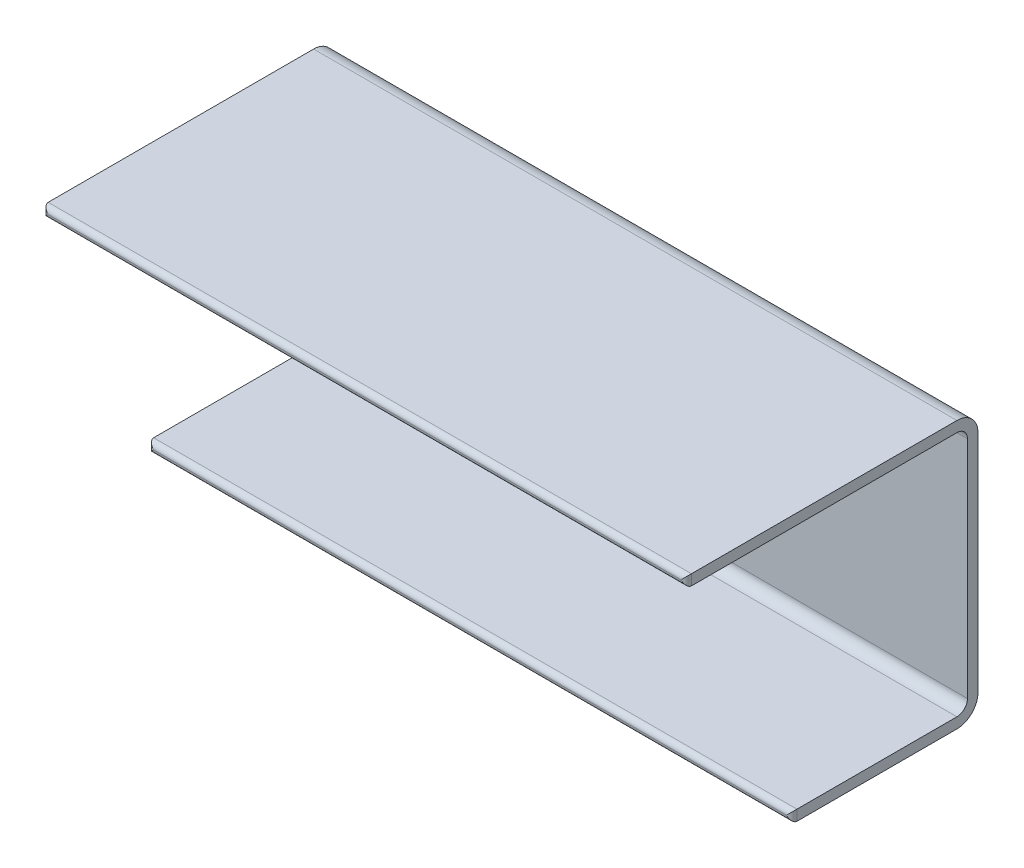
ISO-10303-21;
HEADER;
FILE_DESCRIPTION(('STEP AP214'),'2;1');
FILE_NAME('part.step','',(''),(''),'','','');
FILE_SCHEMA(('AUTOMOTIVE_DESIGN { 1 0 10303 214 1 1 1 1 }'));
ENDSEC;
DATA;
#1=APPLICATION_CONTEXT('core data for automotive mechanical design processes');
#2=APPLICATION_PROTOCOL_DEFINITION('international standard','automotive_design',2000,#1);
#3=PRODUCT_CONTEXT('',#1,'mechanical');
#4=PRODUCT('Part','Part','',(#3));
#5=PRODUCT_RELATED_PRODUCT_CATEGORY('part','',(#4));
#6=PRODUCT_DEFINITION_FORMATION('','',#4);
#7=PRODUCT_DEFINITION_CONTEXT('part definition',#1,'design');
#8=PRODUCT_DEFINITION('design','',#6,#7);
#9=PRODUCT_DEFINITION_SHAPE('','',#8);
#10=(LENGTH_UNIT() NAMED_UNIT(*) SI_UNIT(.MILLI.,.METRE.));
#11=(NAMED_UNIT(*) PLANE_ANGLE_UNIT() SI_UNIT($,.RADIAN.));
#12=(NAMED_UNIT(*) SI_UNIT($,.STERADIAN.) SOLID_ANGLE_UNIT());
#13=UNCERTAINTY_MEASURE_WITH_UNIT(LENGTH_MEASURE(1.E-05),#10,'distance_accuracy_value','');
#14=(GEOMETRIC_REPRESENTATION_CONTEXT(3) GLOBAL_UNCERTAINTY_ASSIGNED_CONTEXT((#13)) GLOBAL_UNIT_ASSIGNED_CONTEXT((#10,
#11,#12)) REPRESENTATION_CONTEXT('',''));
#15=CARTESIAN_POINT('',(0.,0.,0.));
#16=DIRECTION('',(0.,0.,1.));
#17=DIRECTION('',(1.,0.,0.));
#18=AXIS2_PLACEMENT_3D('',#15,#16,#17);
#19=CARTESIAN_POINT('',(0.,0.,-25.));
#20=DIRECTION('',(0.,0.,1.));
#21=DIRECTION('',(1.,0.,0.));
#22=AXIS2_PLACEMENT_3D('',#19,#20,#21);
#23=PLANE('',#22);
#24=CARTESIAN_POINT('',(-14.,45.5,-25.));
#25=DIRECTION('',(0.,0.,1.));
#26=DIRECTION('',(1.,0.,0.));
#27=AXIS2_PLACEMENT_3D('',#24,#25,#26);
#28=CIRCLE('',#27,11.);
#29=CARTESIAN_POINT('',(-14.,56.5,-25.));
#30=VERTEX_POINT('',#29);
#31=CARTESIAN_POINT('',(-14.,34.5,-25.));
#32=VERTEX_POINT('',#31);
#33=EDGE_CURVE('E178',#30,#32,#28,.T.);
#34=ORIENTED_EDGE('',*,*,#33,.F.);
#35=DIRECTION('',(-1.,0.,0.));
#36=VECTOR('',#35,1.);
#37=CARTESIAN_POINT('',(-14.,56.5,-25.));
#38=LINE('',#37,#36);
#39=CARTESIAN_POINT('',(14.,56.5,-25.));
#40=VERTEX_POINT('',#39);
#41=EDGE_CURVE('E184',#40,#30,#38,.T.);
#42=ORIENTED_EDGE('',*,*,#41,.F.);
#43=CARTESIAN_POINT('',(14.,45.5,-25.));
#44=DIRECTION('',(0.,0.,1.));
#45=DIRECTION('',(1.,0.,0.));
#46=AXIS2_PLACEMENT_3D('',#43,#44,#45);
#47=CIRCLE('',#46,11.);
#48=CARTESIAN_POINT('',(14.,34.5,-25.));
#49=VERTEX_POINT('',#48);
#50=EDGE_CURVE('E212',#49,#40,#47,.T.);
#51=ORIENTED_EDGE('',*,*,#50,.F.);
#52=DIRECTION('',(1.,0.,0.));
#53=VECTOR('',#52,1.);
#54=CARTESIAN_POINT('',(-14.,34.5,-25.));
#55=LINE('',#54,#53);
#56=EDGE_CURVE('E204',#32,#49,#55,.T.);
#57=ORIENTED_EDGE('',*,*,#56,.F.);
#58=EDGE_LOOP('',(#34,#42,#51,#57));
#59=FACE_BOUND('',#58,.T.);
#60=DIRECTION('',(0.,-1.,0.));
#61=VECTOR('',#60,1.);
#62=CARTESIAN_POINT('',(91.5,0.,-25.));
#63=LINE('',#62,#61);
#64=CARTESIAN_POINT('',(91.5,70.,-25.));
#65=VERTEX_POINT('',#64);
#66=CARTESIAN_POINT('',(91.5,6.,-25.));
#67=VERTEX_POINT('',#66);
#68=EDGE_CURVE('E235',#65,#67,#63,.T.);
#69=ORIENTED_EDGE('',*,*,#68,.F.);
#70=DIRECTION('',(1.,0.,0.));
#71=VECTOR('',#70,1.);
#72=CARTESIAN_POINT('',(0.,70.,-25.));
#73=LINE('',#72,#71);
#74=CARTESIAN_POINT('',(-91.5,70.,-25.));
#75=VERTEX_POINT('',#74);
#76=EDGE_CURVE('E341',#65,#75,#73,.F.);
#77=ORIENTED_EDGE('',*,*,#76,.T.);
#78=DIRECTION('',(0.,1.,0.));
#79=VECTOR('',#78,1.);
#80=CARTESIAN_POINT('',(-91.5,0.,-25.));
#81=LINE('',#80,#79);
#82=CARTESIAN_POINT('',(-91.5,6.,-25.));
#83=VERTEX_POINT('',#82);
#84=EDGE_CURVE('E241',#83,#75,#81,.T.);
#85=ORIENTED_EDGE('',*,*,#84,.F.);
#86=DIRECTION('',(-1.,0.,0.));
#87=VECTOR('',#86,1.);
#88=CARTESIAN_POINT('',(0.,6.,-25.));
#89=LINE('',#88,#87);
#90=EDGE_CURVE('E338',#83,#67,#89,.F.);
#91=ORIENTED_EDGE('',*,*,#90,.T.);
#92=EDGE_LOOP('',(#69,#77,#85,#91));
#93=FACE_BOUND('',#92,.T.);
#94=ADVANCED_FACE('F45',(#59,#93),#23,.T.);
#95=CARTESIAN_POINT('',(91.5,3.,25.));
#96=DIRECTION('',(-1.,0.,0.));
#97=DIRECTION('',(0.,0.,1.));
#98=AXIS2_PLACEMENT_3D('',#95,#96,#97);
#99=PLANE('',#98);
#100=DIRECTION('',(0.,-1.,0.));
#101=VECTOR('',#100,1.);
#102=CARTESIAN_POINT('',(91.5,0.,-28.));
#103=LINE('',#102,#101);
#104=CARTESIAN_POINT('',(91.5,70.,-28.));
#105=VERTEX_POINT('',#104);
#106=CARTESIAN_POINT('',(91.5,6.,-28.));
#107=VERTEX_POINT('',#106);
#108=EDGE_CURVE('E236',#105,#107,#103,.T.);
#109=ORIENTED_EDGE('',*,*,#108,.F.);
#110=CARTESIAN_POINT('',(91.5,70.,-22.));
#111=DIRECTION('',(-1.,0.,0.));
#112=DIRECTION('',(0.,0.,1.));
#113=AXIS2_PLACEMENT_3D('',#110,#111,#112);
#114=CIRCLE('',#113,6.);
#115=CARTESIAN_POINT('',(91.5,76.,-22.));
#116=VERTEX_POINT('',#115);
#117=EDGE_CURVE('E371',#105,#116,#114,.F.);
#118=ORIENTED_EDGE('',*,*,#117,.T.);
#119=DIRECTION('',(0.,0.,1.));
#120=VECTOR('',#119,1.);
#121=CARTESIAN_POINT('',(91.5,76.,-28.));
#122=LINE('',#121,#120);
#123=CARTESIAN_POINT('',(91.5,76.,53.5));
#124=VERTEX_POINT('',#123);
#125=EDGE_CURVE('E245',#116,#124,#122,.T.);
#126=ORIENTED_EDGE('',*,*,#125,.T.);
#127=DIRECTION('',(0.,1.,0.));
#128=VECTOR('',#127,1.);
#129=CARTESIAN_POINT('',(91.5,73.,53.5));
#130=LINE('',#129,#128);
#131=CARTESIAN_POINT('',(91.5,73.,53.5));
#132=VERTEX_POINT('',#131);
#133=EDGE_CURVE('E282',#124,#132,#130,.F.);
#134=ORIENTED_EDGE('',*,*,#133,.T.);
#135=DIRECTION('',(0.,0.,-1.));
#136=VECTOR('',#135,1.);
#137=CARTESIAN_POINT('',(91.5,73.,55.));
#138=LINE('',#137,#136);
#139=CARTESIAN_POINT('',(91.5,73.,-22.));
#140=VERTEX_POINT('',#139);
#141=EDGE_CURVE('E226',#132,#140,#138,.T.);
#142=ORIENTED_EDGE('',*,*,#141,.T.);
#143=CARTESIAN_POINT('',(91.5,70.,-22.));
#144=DIRECTION('',(-1.,0.,0.));
#145=DIRECTION('',(0.,0.,1.));
#146=AXIS2_PLACEMENT_3D('',#143,#144,#145);
#147=CIRCLE('',#146,3.);
#148=EDGE_CURVE('E348',#140,#65,#147,.T.);
#149=ORIENTED_EDGE('',*,*,#148,.T.);
#150=ORIENTED_EDGE('',*,*,#68,.T.);
#151=CARTESIAN_POINT('',(91.5,6.,-22.));
#152=DIRECTION('',(-1.,0.,0.));
#153=DIRECTION('',(0.,0.,1.));
#154=AXIS2_PLACEMENT_3D('',#151,#152,#153);
#155=CIRCLE('',#154,3.);
#156=CARTESIAN_POINT('',(91.5,3.,-22.));
#157=VERTEX_POINT('',#156);
#158=EDGE_CURVE('E357',#67,#157,#155,.T.);
#159=ORIENTED_EDGE('',*,*,#158,.T.);
#160=DIRECTION('',(0.,0.,-1.));
#161=VECTOR('',#160,1.);
#162=CARTESIAN_POINT('',(91.5,3.,25.));
#163=LINE('',#162,#161);
#164=CARTESIAN_POINT('',(91.5,3.,23.5));
#165=VERTEX_POINT('',#164);
#166=EDGE_CURVE('E258',#165,#157,#163,.T.);
#167=ORIENTED_EDGE('',*,*,#166,.F.);
#168=DIRECTION('',(0.,-1.,0.));
#169=VECTOR('',#168,1.);
#170=CARTESIAN_POINT('',(91.5,3.,23.5));
#171=LINE('',#170,#169);
#172=CARTESIAN_POINT('',(91.5,0.,23.5));
#173=VERTEX_POINT('',#172);
#174=EDGE_CURVE('E285',#165,#173,#171,.T.);
#175=ORIENTED_EDGE('',*,*,#174,.T.);
#176=DIRECTION('',(0.,0.,-1.));
#177=VECTOR('',#176,1.);
#178=CARTESIAN_POINT('',(91.5,0.,25.));
#179=LINE('',#178,#177);
#180=CARTESIAN_POINT('',(91.5,0.,-22.));
#181=VERTEX_POINT('',#180);
#182=EDGE_CURVE('E257',#173,#181,#179,.T.);
#183=ORIENTED_EDGE('',*,*,#182,.T.);
#184=CARTESIAN_POINT('',(91.5,6.,-22.));
#185=DIRECTION('',(-1.,0.,0.));
#186=DIRECTION('',(0.,0.,1.));
#187=AXIS2_PLACEMENT_3D('',#184,#185,#186);
#188=CIRCLE('',#187,6.);
#189=EDGE_CURVE('E368',#181,#107,#188,.F.);
#190=ORIENTED_EDGE('',*,*,#189,.T.);
#191=EDGE_LOOP('',(#109,#118,#126,#134,#142,#149,#150,#159,#167,#175,#183,#190));
#192=FACE_BOUND('',#191,.T.);
#193=ADVANCED_FACE('F386',(#192),#99,.F.);
#194=CARTESIAN_POINT('',(-91.5,3.,25.));
#195=DIRECTION('',(1.,0.,0.));
#196=DIRECTION('',(0.,0.,-1.));
#197=AXIS2_PLACEMENT_3D('',#194,#195,#196);
#198=PLANE('',#197);
#199=DIRECTION('',(0.,0.,1.));
#200=VECTOR('',#199,1.);
#201=CARTESIAN_POINT('',(-91.5,76.,-28.));
#202=LINE('',#201,#200);
#203=CARTESIAN_POINT('',(-91.5,76.,-22.));
#204=VERTEX_POINT('',#203);
#205=CARTESIAN_POINT('',(-91.5,76.,53.5));
#206=VERTEX_POINT('',#205);
#207=EDGE_CURVE('E254',#204,#206,#202,.T.);
#208=ORIENTED_EDGE('',*,*,#207,.F.);
#209=CARTESIAN_POINT('',(-91.5,70.,-22.));
#210=DIRECTION('',(1.,0.,0.));
#211=DIRECTION('',(0.,0.,-1.));
#212=AXIS2_PLACEMENT_3D('',#209,#210,#211);
#213=CIRCLE('',#212,6.);
#214=CARTESIAN_POINT('',(-91.5,70.,-28.));
#215=VERTEX_POINT('',#214);
#216=EDGE_CURVE('E54',#204,#215,#213,.F.);
#217=ORIENTED_EDGE('',*,*,#216,.T.);
#218=DIRECTION('',(0.,1.,0.));
#219=VECTOR('',#218,1.);
#220=CARTESIAN_POINT('',(-91.5,0.,-28.));
#221=LINE('',#220,#219);
#222=CARTESIAN_POINT('',(-91.5,6.,-28.));
#223=VERTEX_POINT('',#222);
#224=EDGE_CURVE('E240',#223,#215,#221,.T.);
#225=ORIENTED_EDGE('',*,*,#224,.F.);
#226=CARTESIAN_POINT('',(-91.5,6.,-22.));
#227=DIRECTION('',(1.,0.,0.));
#228=DIRECTION('',(0.,0.,-1.));
#229=AXIS2_PLACEMENT_3D('',#226,#227,#228);
#230=CIRCLE('',#229,6.);
#231=CARTESIAN_POINT('',(-91.5,0.,-22.));
#232=VERTEX_POINT('',#231);
#233=EDGE_CURVE('E61',#223,#232,#230,.F.);
#234=ORIENTED_EDGE('',*,*,#233,.T.);
#235=DIRECTION('',(0.,0.,1.));
#236=VECTOR('',#235,1.);
#237=CARTESIAN_POINT('',(-91.5,0.,25.));
#238=LINE('',#237,#236);
#239=CARTESIAN_POINT('',(-91.5,0.,23.5));
#240=VERTEX_POINT('',#239);
#241=EDGE_CURVE('E263',#232,#240,#238,.T.);
#242=ORIENTED_EDGE('',*,*,#241,.T.);
#243=DIRECTION('',(0.,-1.,0.));
#244=VECTOR('',#243,1.);
#245=CARTESIAN_POINT('',(-91.5,3.,23.5));
#246=LINE('',#245,#244);
#247=CARTESIAN_POINT('',(-91.5,3.,23.5));
#248=VERTEX_POINT('',#247);
#249=EDGE_CURVE('E275',#240,#248,#246,.F.);
#250=ORIENTED_EDGE('',*,*,#249,.T.);
#251=DIRECTION('',(0.,0.,1.));
#252=VECTOR('',#251,1.);
#253=CARTESIAN_POINT('',(-91.5,3.,25.));
#254=LINE('',#253,#252);
#255=CARTESIAN_POINT('',(-91.5,3.,-22.));
#256=VERTEX_POINT('',#255);
#257=EDGE_CURVE('E262',#256,#248,#254,.T.);
#258=ORIENTED_EDGE('',*,*,#257,.F.);
#259=CARTESIAN_POINT('',(-91.5,6.,-22.));
#260=DIRECTION('',(1.,0.,0.));
#261=DIRECTION('',(0.,0.,-1.));
#262=AXIS2_PLACEMENT_3D('',#259,#260,#261);
#263=CIRCLE('',#262,3.);
#264=EDGE_CURVE('E354',#256,#83,#263,.T.);
#265=ORIENTED_EDGE('',*,*,#264,.T.);
#266=ORIENTED_EDGE('',*,*,#84,.T.);
#267=CARTESIAN_POINT('',(-91.5,70.,-22.));
#268=DIRECTION('',(1.,0.,0.));
#269=DIRECTION('',(0.,0.,-1.));
#270=AXIS2_PLACEMENT_3D('',#267,#268,#269);
#271=CIRCLE('',#270,3.);
#272=CARTESIAN_POINT('',(-91.5,73.,-22.));
#273=VERTEX_POINT('',#272);
#274=EDGE_CURVE('E351',#75,#273,#271,.T.);
#275=ORIENTED_EDGE('',*,*,#274,.T.);
#276=DIRECTION('',(0.,0.,-1.));
#277=VECTOR('',#276,1.);
#278=CARTESIAN_POINT('',(-91.5,73.,55.));
#279=LINE('',#278,#277);
#280=CARTESIAN_POINT('',(-91.5,73.,53.5));
#281=VERTEX_POINT('',#280);
#282=EDGE_CURVE('E230',#281,#273,#279,.T.);
#283=ORIENTED_EDGE('',*,*,#282,.F.);
#284=DIRECTION('',(0.,-1.,0.));
#285=VECTOR('',#284,1.);
#286=CARTESIAN_POINT('',(-91.5,76.,53.5));
#287=LINE('',#286,#285);
#288=EDGE_CURVE('E266',#281,#206,#287,.F.);
#289=ORIENTED_EDGE('',*,*,#288,.T.);
#290=EDGE_LOOP('',(#208,#217,#225,#234,#242,#250,#258,#265,#266,#275,#283,#289));
#291=FACE_BOUND('',#290,.T.);
#292=ADVANCED_FACE('F379',(#291),#198,.F.);
#293=CARTESIAN_POINT('',(0.,3.,0.));
#294=DIRECTION('',(0.,-1.,0.));
#295=DIRECTION('',(0.,0.,-1.));
#296=AXIS2_PLACEMENT_3D('',#293,#294,#295);
#297=PLANE('',#296);
#298=ORIENTED_EDGE('',*,*,#166,.T.);
#299=DIRECTION('',(-1.,0.,0.));
#300=VECTOR('',#299,1.);
#301=CARTESIAN_POINT('',(0.,3.,-22.));
#302=LINE('',#301,#300);
#303=EDGE_CURVE('E344',#157,#256,#302,.T.);
#304=ORIENTED_EDGE('',*,*,#303,.T.);
#305=ORIENTED_EDGE('',*,*,#257,.T.);
#306=DIRECTION('',(1.,0.,0.));
#307=VECTOR('',#306,1.);
#308=CARTESIAN_POINT('',(0.,3.,23.5));
#309=LINE('',#308,#307);
#310=EDGE_CURVE('E279',#248,#165,#309,.T.);
#311=ORIENTED_EDGE('',*,*,#310,.T.);
#312=EDGE_LOOP('',(#298,#304,#305,#311));
#313=FACE_BOUND('',#312,.T.);
#314=ADVANCED_FACE('F425',(#313),#297,.F.);
#315=CARTESIAN_POINT('',(0.,0.,0.));
#316=DIRECTION('',(0.,-1.,0.));
#317=DIRECTION('',(0.,0.,-1.));
#318=AXIS2_PLACEMENT_3D('',#315,#316,#317);
#319=PLANE('',#318);
#320=ORIENTED_EDGE('',*,*,#241,.F.);
#321=DIRECTION('',(-1.,0.,0.));
#322=VECTOR('',#321,1.);
#323=CARTESIAN_POINT('',(91.5,0.,-22.));
#324=LINE('',#323,#322);
#325=EDGE_CURVE('E11',#232,#181,#324,.F.);
#326=ORIENTED_EDGE('',*,*,#325,.T.);
#327=ORIENTED_EDGE('',*,*,#182,.F.);
#328=DIRECTION('',(1.,0.,0.));
#329=VECTOR('',#328,1.);
#330=CARTESIAN_POINT('',(-91.5,0.,23.5));
#331=LINE('',#330,#329);
#332=EDGE_CURVE('E288',#173,#240,#331,.F.);
#333=ORIENTED_EDGE('',*,*,#332,.T.);
#334=EDGE_LOOP('',(#320,#326,#327,#333));
#335=FACE_BOUND('',#334,.T.);
#336=ADVANCED_FACE('F445',(#335),#319,.T.);
#337=CARTESIAN_POINT('',(91.5,76.,-28.));
#338=DIRECTION('',(0.,-1.,0.));
#339=DIRECTION('',(0.,0.,-1.));
#340=AXIS2_PLACEMENT_3D('',#337,#338,#339);
#341=PLANE('',#340);
#342=ORIENTED_EDGE('',*,*,#125,.F.);
#343=DIRECTION('',(1.,0.,0.));
#344=VECTOR('',#343,1.);
#345=CARTESIAN_POINT('',(91.5,76.,-22.));
#346=LINE('',#345,#344);
#347=EDGE_CURVE('E69',#116,#204,#346,.F.);
#348=ORIENTED_EDGE('',*,*,#347,.T.);
#349=ORIENTED_EDGE('',*,*,#207,.T.);
#350=DIRECTION('',(-1.,0.,0.));
#351=VECTOR('',#350,1.);
#352=CARTESIAN_POINT('',(91.5,76.,53.5));
#353=LINE('',#352,#351);
#354=EDGE_CURVE('E292',#206,#124,#353,.F.);
#355=ORIENTED_EDGE('',*,*,#354,.T.);
#356=EDGE_LOOP('',(#342,#348,#349,#355));
#357=FACE_BOUND('',#356,.T.);
#358=ADVANCED_FACE('F387',(#357),#341,.F.);
#359=CARTESIAN_POINT('',(0.,0.,-28.));
#360=DIRECTION('',(0.,0.,1.));
#361=DIRECTION('',(1.,0.,0.));
#362=AXIS2_PLACEMENT_3D('',#359,#360,#361);
#363=PLANE('',#362);
#364=DIRECTION('',(1.,0.,0.));
#365=VECTOR('',#364,1.);
#366=CARTESIAN_POINT('',(-14.,56.5,-28.));
#367=LINE('',#366,#365);
#368=CARTESIAN_POINT('',(-14.,56.5,-28.));
#369=VERTEX_POINT('',#368);
#370=CARTESIAN_POINT('',(14.,56.5,-28.));
#371=VERTEX_POINT('',#370);
#372=EDGE_CURVE('E199',#369,#371,#367,.T.);
#373=ORIENTED_EDGE('',*,*,#372,.F.);
#374=CARTESIAN_POINT('',(-14.,45.5,-28.));
#375=DIRECTION('',(0.,0.,1.));
#376=DIRECTION('',(1.,0.,0.));
#377=AXIS2_PLACEMENT_3D('',#374,#375,#376);
#378=CIRCLE('',#377,11.);
#379=CARTESIAN_POINT('',(-14.,34.5,-28.));
#380=VERTEX_POINT('',#379);
#381=EDGE_CURVE('E175',#380,#369,#378,.F.);
#382=ORIENTED_EDGE('',*,*,#381,.F.);
#383=DIRECTION('',(-1.,0.,0.));
#384=VECTOR('',#383,1.);
#385=CARTESIAN_POINT('',(-14.,34.5,-28.));
#386=LINE('',#385,#384);
#387=CARTESIAN_POINT('',(14.,34.5,-28.));
#388=VERTEX_POINT('',#387);
#389=EDGE_CURVE('E188',#388,#380,#386,.T.);
#390=ORIENTED_EDGE('',*,*,#389,.F.);
#391=CARTESIAN_POINT('',(14.,45.5,-28.));
#392=DIRECTION('',(0.,0.,1.));
#393=DIRECTION('',(1.,0.,0.));
#394=AXIS2_PLACEMENT_3D('',#391,#392,#393);
#395=CIRCLE('',#394,11.);
#396=EDGE_CURVE('E206',#371,#388,#395,.F.);
#397=ORIENTED_EDGE('',*,*,#396,.F.);
#398=EDGE_LOOP('',(#373,#382,#390,#397));
#399=FACE_BOUND('',#398,.T.);
#400=ORIENTED_EDGE('',*,*,#224,.T.);
#401=DIRECTION('',(1.,0.,0.));
#402=VECTOR('',#401,1.);
#403=CARTESIAN_POINT('',(0.,70.,-28.));
#404=LINE('',#403,#402);
#405=EDGE_CURVE('E364',#215,#105,#404,.T.);
#406=ORIENTED_EDGE('',*,*,#405,.T.);
#407=ORIENTED_EDGE('',*,*,#108,.T.);
#408=DIRECTION('',(-1.,0.,0.));
#409=VECTOR('',#408,1.);
#410=CARTESIAN_POINT('',(-91.5,6.,-28.));
#411=LINE('',#410,#409);
#412=EDGE_CURVE('E360',#107,#223,#411,.T.);
#413=ORIENTED_EDGE('',*,*,#412,.T.);
#414=EDGE_LOOP('',(#400,#406,#407,#413));
#415=FACE_BOUND('',#414,.T.);
#416=ADVANCED_FACE('F196',(#399,#415),#363,.F.);
#417=CARTESIAN_POINT('',(-91.5,73.,55.));
#418=DIRECTION('',(0.,1.,0.));
#419=DIRECTION('',(0.,0.,1.));
#420=AXIS2_PLACEMENT_3D('',#417,#418,#419);
#421=PLANE('',#420);
#422=ORIENTED_EDGE('',*,*,#282,.T.);
#423=DIRECTION('',(1.,0.,0.));
#424=VECTOR('',#423,1.);
#425=CARTESIAN_POINT('',(-91.5,73.,-22.));
#426=LINE('',#425,#424);
#427=EDGE_CURVE('E299',#273,#140,#426,.T.);
#428=ORIENTED_EDGE('',*,*,#427,.T.);
#429=ORIENTED_EDGE('',*,*,#141,.F.);
#430=DIRECTION('',(1.,0.,0.));
#431=VECTOR('',#430,1.);
#432=CARTESIAN_POINT('',(-91.5,73.,53.5));
#433=LINE('',#432,#431);
#434=EDGE_CURVE('E296',#132,#281,#433,.F.);
#435=ORIENTED_EDGE('',*,*,#434,.T.);
#436=EDGE_LOOP('',(#422,#428,#429,#435));
#437=FACE_BOUND('',#436,.T.);
#438=ADVANCED_FACE('F407',(#437),#421,.F.);
#439=CARTESIAN_POINT('',(90.,3.,23.5));
#440=DIRECTION('',(0.,-1.,0.));
#441=DIRECTION('',(0.,0.,-1.));
#442=AXIS2_PLACEMENT_3D('',#439,#440,#441);
#443=CYLINDRICAL_SURFACE('',#442,1.5);
#444=CARTESIAN_POINT('',(90.,1.5,23.5));
#445=DIRECTION('',(-0.707106781186547,-0.707106781186547,0.));
#446=DIRECTION('',(-0.707106781186547,0.707106781186547,0.));
#447=AXIS2_PLACEMENT_3D('',#444,#445,#446);
#448=ELLIPSE('',#447,2.12132034355964,1.5);
#449=CARTESIAN_POINT('',(90.,1.5,25.));
#450=VERTEX_POINT('',#449);
#451=EDGE_CURVE('E309',#173,#450,#448,.T.);
#452=ORIENTED_EDGE('',*,*,#451,.F.);
#453=ORIENTED_EDGE('',*,*,#174,.F.);
#454=CARTESIAN_POINT('',(90.,1.5,23.5));
#455=DIRECTION('',(0.707106781186547,-0.707106781186547,0.));
#456=DIRECTION('',(-0.707106781186547,-0.707106781186547,0.));
#457=AXIS2_PLACEMENT_3D('',#454,#455,#456);
#458=ELLIPSE('',#457,2.12132034355964,1.5);
#459=EDGE_CURVE('E231',#450,#165,#458,.F.);
#460=ORIENTED_EDGE('',*,*,#459,.F.);
#461=EDGE_LOOP('',(#452,#453,#460));
#462=FACE_BOUND('',#461,.T.);
#463=ADVANCED_FACE('F441',(#462),#443,.T.);
#464=CARTESIAN_POINT('',(0.,1.5,23.5));
#465=DIRECTION('',(1.,0.,0.));
#466=DIRECTION('',(0.,0.,-1.));
#467=AXIS2_PLACEMENT_3D('',#464,#465,#466);
#468=CYLINDRICAL_SURFACE('',#467,1.5);
#469=DIRECTION('',(1.,0.,0.));
#470=VECTOR('',#469,1.);
#471=CARTESIAN_POINT('',(-91.5,1.5,25.));
#472=LINE('',#471,#470);
#473=CARTESIAN_POINT('',(-90.,1.5,25.));
#474=VERTEX_POINT('',#473);
#475=EDGE_CURVE('E313',#450,#474,#472,.F.);
#476=ORIENTED_EDGE('',*,*,#475,.F.);
#477=ORIENTED_EDGE('',*,*,#459,.T.);
#478=ORIENTED_EDGE('',*,*,#310,.F.);
#479=CARTESIAN_POINT('',(-90.,1.5,23.5));
#480=DIRECTION('',(0.707106781186547,0.707106781186547,0.));
#481=DIRECTION('',(0.707106781186547,-0.707106781186547,0.));
#482=AXIS2_PLACEMENT_3D('',#479,#480,#481);
#483=ELLIPSE('',#482,2.12132034355964,1.5);
#484=EDGE_CURVE('E304',#474,#248,#483,.F.);
#485=ORIENTED_EDGE('',*,*,#484,.F.);
#486=EDGE_LOOP('',(#476,#477,#478,#485));
#487=FACE_BOUND('',#486,.T.);
#488=ADVANCED_FACE('F431',(#487),#468,.T.);
#489=CARTESIAN_POINT('',(-91.5,1.5,23.5));
#490=DIRECTION('',(-1.,0.,0.));
#491=DIRECTION('',(0.,0.,1.));
#492=AXIS2_PLACEMENT_3D('',#489,#490,#491);
#493=CYLINDRICAL_SURFACE('',#492,1.5);
#494=ORIENTED_EDGE('',*,*,#451,.T.);
#495=ORIENTED_EDGE('',*,*,#475,.T.);
#496=CARTESIAN_POINT('',(-90.,1.5,23.5));
#497=DIRECTION('',(-0.707106781186547,0.707106781186547,0.));
#498=DIRECTION('',(-0.707106781186547,-0.707106781186547,0.));
#499=AXIS2_PLACEMENT_3D('',#496,#497,#498);
#500=ELLIPSE('',#499,2.12132034355964,1.5);
#501=EDGE_CURVE('E300',#240,#474,#500,.T.);
#502=ORIENTED_EDGE('',*,*,#501,.F.);
#503=ORIENTED_EDGE('',*,*,#332,.F.);
#504=EDGE_LOOP('',(#494,#495,#502,#503));
#505=FACE_BOUND('',#504,.T.);
#506=ADVANCED_FACE('F438',(#505),#493,.T.);
#507=CARTESIAN_POINT('',(-90.,3.,23.5));
#508=DIRECTION('',(0.,-1.,0.));
#509=DIRECTION('',(0.,0.,-1.));
#510=AXIS2_PLACEMENT_3D('',#507,#508,#509);
#511=CYLINDRICAL_SURFACE('',#510,1.5);
#512=ORIENTED_EDGE('',*,*,#484,.T.);
#513=ORIENTED_EDGE('',*,*,#249,.F.);
#514=ORIENTED_EDGE('',*,*,#501,.T.);
#515=EDGE_LOOP('',(#512,#513,#514));
#516=FACE_BOUND('',#515,.T.);
#517=ADVANCED_FACE('F435',(#516),#511,.T.);
#518=CARTESIAN_POINT('',(90.,0.,53.5));
#519=DIRECTION('',(0.,-1.,0.));
#520=DIRECTION('',(0.,0.,-1.));
#521=AXIS2_PLACEMENT_3D('',#518,#519,#520);
#522=CYLINDRICAL_SURFACE('',#521,1.5);
#523=CARTESIAN_POINT('',(90.,74.5,53.5));
#524=DIRECTION('',(-0.707106781186547,-0.707106781186547,0.));
#525=DIRECTION('',(-0.707106781186547,0.707106781186547,0.));
#526=AXIS2_PLACEMENT_3D('',#523,#524,#525);
#527=ELLIPSE('',#526,2.12132034355964,1.5);
#528=CARTESIAN_POINT('',(90.,74.5,55.));
#529=VERTEX_POINT('',#528);
#530=EDGE_CURVE('E305',#132,#529,#527,.T.);
#531=ORIENTED_EDGE('',*,*,#530,.F.);
#532=ORIENTED_EDGE('',*,*,#133,.F.);
#533=CARTESIAN_POINT('',(90.,74.5,53.5));
#534=DIRECTION('',(0.707106781186547,-0.707106781186547,0.));
#535=DIRECTION('',(-0.707106781186547,-0.707106781186547,0.));
#536=AXIS2_PLACEMENT_3D('',#533,#534,#535);
#537=ELLIPSE('',#536,2.12132034355964,1.5);
#538=EDGE_CURVE('E326',#529,#124,#537,.F.);
#539=ORIENTED_EDGE('',*,*,#538,.F.);
#540=EDGE_LOOP('',(#531,#532,#539));
#541=FACE_BOUND('',#540,.T.);
#542=ADVANCED_FACE('F404',(#541),#522,.T.);
#543=CARTESIAN_POINT('',(0.,74.5,53.5));
#544=DIRECTION('',(-1.,0.,0.));
#545=DIRECTION('',(0.,0.,1.));
#546=AXIS2_PLACEMENT_3D('',#543,#544,#545);
#547=CYLINDRICAL_SURFACE('',#546,1.5);
#548=CARTESIAN_POINT('',(-90.,74.5,53.5));
#549=DIRECTION('',(-0.707106781186547,0.707106781186547,0.));
#550=DIRECTION('',(0.707106781186547,0.707106781186547,0.));
#551=AXIS2_PLACEMENT_3D('',#548,#549,#550);
#552=ELLIPSE('',#551,2.12132034355964,1.5);
#553=CARTESIAN_POINT('',(-90.,74.5,55.));
#554=VERTEX_POINT('',#553);
#555=EDGE_CURVE('E330',#281,#554,#552,.T.);
#556=ORIENTED_EDGE('',*,*,#555,.F.);
#557=ORIENTED_EDGE('',*,*,#434,.F.);
#558=ORIENTED_EDGE('',*,*,#530,.T.);
#559=DIRECTION('',(1.,0.,0.));
#560=VECTOR('',#559,1.);
#561=CARTESIAN_POINT('',(91.5,74.5,55.));
#562=LINE('',#561,#560);
#563=EDGE_CURVE('E322',#554,#529,#562,.T.);
#564=ORIENTED_EDGE('',*,*,#563,.F.);
#565=EDGE_LOOP('',(#556,#557,#558,#564));
#566=FACE_BOUND('',#565,.T.);
#567=ADVANCED_FACE('F401',(#566),#547,.T.);
#568=CARTESIAN_POINT('',(-90.,0.,53.5));
#569=DIRECTION('',(0.,1.,0.));
#570=DIRECTION('',(0.,0.,1.));
#571=AXIS2_PLACEMENT_3D('',#568,#569,#570);
#572=CYLINDRICAL_SURFACE('',#571,1.5);
#573=ORIENTED_EDGE('',*,*,#288,.F.);
#574=ORIENTED_EDGE('',*,*,#555,.T.);
#575=CARTESIAN_POINT('',(-90.,74.5,53.5));
#576=DIRECTION('',(0.707106781186547,0.707106781186547,0.));
#577=DIRECTION('',(-0.707106781186547,0.707106781186547,0.));
#578=AXIS2_PLACEMENT_3D('',#575,#576,#577);
#579=ELLIPSE('',#578,2.12132034355964,1.5);
#580=EDGE_CURVE('E193',#206,#554,#579,.T.);
#581=ORIENTED_EDGE('',*,*,#580,.F.);
#582=EDGE_LOOP('',(#573,#574,#581));
#583=FACE_BOUND('',#582,.T.);
#584=ADVANCED_FACE('F396',(#583),#572,.T.);
#585=CARTESIAN_POINT('',(0.,74.5,53.5));
#586=DIRECTION('',(1.,0.,0.));
#587=DIRECTION('',(0.,0.,-1.));
#588=AXIS2_PLACEMENT_3D('',#585,#586,#587);
#589=CYLINDRICAL_SURFACE('',#588,1.5);
#590=ORIENTED_EDGE('',*,*,#538,.T.);
#591=ORIENTED_EDGE('',*,*,#354,.F.);
#592=ORIENTED_EDGE('',*,*,#580,.T.);
#593=ORIENTED_EDGE('',*,*,#563,.T.);
#594=EDGE_LOOP('',(#590,#591,#592,#593));
#595=FACE_BOUND('',#594,.T.);
#596=ADVANCED_FACE('F391',(#595),#589,.T.);
#597=CARTESIAN_POINT('',(-14.,45.5,-28.001));
#598=DIRECTION('',(0.,0.,1.));
#599=DIRECTION('',(1.,0.,0.));
#600=AXIS2_PLACEMENT_3D('',#597,#598,#599);
#601=CYLINDRICAL_SURFACE('',#600,11.);
#602=ORIENTED_EDGE('',*,*,#381,.T.);
#603=DIRECTION('',(0.,0.,1.));
#604=VECTOR('',#603,1.);
#605=CARTESIAN_POINT('',(-14.,56.5,-28.001));
#606=LINE('',#605,#604);
#607=EDGE_CURVE('E194',#369,#30,#606,.T.);
#608=ORIENTED_EDGE('',*,*,#607,.T.);
#609=ORIENTED_EDGE('',*,*,#33,.T.);
#610=DIRECTION('',(0.,0.,1.));
#611=VECTOR('',#610,1.);
#612=CARTESIAN_POINT('',(-14.,34.5,-28.001));
#613=LINE('',#612,#611);
#614=EDGE_CURVE('E171',#380,#32,#613,.T.);
#615=ORIENTED_EDGE('',*,*,#614,.F.);
#616=EDGE_LOOP('',(#602,#608,#609,#615));
#617=FACE_BOUND('',#616,.T.);
#618=ADVANCED_FACE('F173',(#617),#601,.F.);
#619=CARTESIAN_POINT('',(-14.,56.5,-28.001));
#620=DIRECTION('',(0.,1.,0.));
#621=DIRECTION('',(-1.,0.,0.));
#622=AXIS2_PLACEMENT_3D('',#619,#620,#621);
#623=PLANE('',#622);
#624=ORIENTED_EDGE('',*,*,#372,.T.);
#625=DIRECTION('',(0.,0.,1.));
#626=VECTOR('',#625,1.);
#627=CARTESIAN_POINT('',(14.,56.5,-28.001));
#628=LINE('',#627,#626);
#629=EDGE_CURVE('E221',#371,#40,#628,.T.);
#630=ORIENTED_EDGE('',*,*,#629,.T.);
#631=ORIENTED_EDGE('',*,*,#41,.T.);
#632=ORIENTED_EDGE('',*,*,#607,.F.);
#633=EDGE_LOOP('',(#624,#630,#631,#632));
#634=FACE_BOUND('',#633,.T.);
#635=ADVANCED_FACE('F553',(#634),#623,.F.);
#636=CARTESIAN_POINT('',(14.,45.5,-28.001));
#637=DIRECTION('',(0.,0.,1.));
#638=DIRECTION('',(1.,0.,0.));
#639=AXIS2_PLACEMENT_3D('',#636,#637,#638);
#640=CYLINDRICAL_SURFACE('',#639,11.);
#641=ORIENTED_EDGE('',*,*,#396,.T.);
#642=DIRECTION('',(0.,0.,1.));
#643=VECTOR('',#642,1.);
#644=CARTESIAN_POINT('',(14.,34.5,-28.001));
#645=LINE('',#644,#643);
#646=EDGE_CURVE('E183',#388,#49,#645,.T.);
#647=ORIENTED_EDGE('',*,*,#646,.T.);
#648=ORIENTED_EDGE('',*,*,#50,.T.);
#649=ORIENTED_EDGE('',*,*,#629,.F.);
#650=EDGE_LOOP('',(#641,#647,#648,#649));
#651=FACE_BOUND('',#650,.T.);
#652=ADVANCED_FACE('F545',(#651),#640,.F.);
#653=CARTESIAN_POINT('',(-14.,34.5,-28.001));
#654=DIRECTION('',(0.,-1.,0.));
#655=DIRECTION('',(1.,0.,0.));
#656=AXIS2_PLACEMENT_3D('',#653,#654,#655);
#657=PLANE('',#656);
#658=ORIENTED_EDGE('',*,*,#389,.T.);
#659=ORIENTED_EDGE('',*,*,#614,.T.);
#660=ORIENTED_EDGE('',*,*,#56,.T.);
#661=ORIENTED_EDGE('',*,*,#646,.F.);
#662=EDGE_LOOP('',(#658,#659,#660,#661));
#663=FACE_BOUND('',#662,.T.);
#664=ADVANCED_FACE('F189',(#663),#657,.F.);
#665=CARTESIAN_POINT('',(-91.5,70.,-22.));
#666=DIRECTION('',(1.,0.,0.));
#667=DIRECTION('',(0.,0.,-1.));
#668=AXIS2_PLACEMENT_3D('',#665,#666,#667);
#669=CYLINDRICAL_SURFACE('',#668,3.);
#670=ORIENTED_EDGE('',*,*,#274,.F.);
#671=ORIENTED_EDGE('',*,*,#76,.F.);
#672=ORIENTED_EDGE('',*,*,#148,.F.);
#673=ORIENTED_EDGE('',*,*,#427,.F.);
#674=EDGE_LOOP('',(#670,#671,#672,#673));
#675=FACE_BOUND('',#674,.T.);
#676=ADVANCED_FACE('F412',(#675),#669,.F.);
#677=CARTESIAN_POINT('',(0.,6.,-22.));
#678=DIRECTION('',(-1.,0.,0.));
#679=DIRECTION('',(0.,0.,1.));
#680=AXIS2_PLACEMENT_3D('',#677,#678,#679);
#681=CYLINDRICAL_SURFACE('',#680,3.);
#682=ORIENTED_EDGE('',*,*,#158,.F.);
#683=ORIENTED_EDGE('',*,*,#90,.F.);
#684=ORIENTED_EDGE('',*,*,#264,.F.);
#685=ORIENTED_EDGE('',*,*,#303,.F.);
#686=EDGE_LOOP('',(#682,#683,#684,#685));
#687=FACE_BOUND('',#686,.T.);
#688=ADVANCED_FACE('F420',(#687),#681,.F.);
#689=CARTESIAN_POINT('',(0.,70.,-22.));
#690=DIRECTION('',(1.,0.,0.));
#691=DIRECTION('',(0.,0.,-1.));
#692=AXIS2_PLACEMENT_3D('',#689,#690,#691);
#693=CYLINDRICAL_SURFACE('',#692,6.);
#694=ORIENTED_EDGE('',*,*,#216,.F.);
#695=ORIENTED_EDGE('',*,*,#347,.F.);
#696=ORIENTED_EDGE('',*,*,#117,.F.);
#697=ORIENTED_EDGE('',*,*,#405,.F.);
#698=EDGE_LOOP('',(#694,#695,#696,#697));
#699=FACE_BOUND('',#698,.T.);
#700=ADVANCED_FACE('F384',(#699),#693,.T.);
#701=CARTESIAN_POINT('',(0.,6.,-22.));
#702=DIRECTION('',(1.,0.,0.));
#703=DIRECTION('',(0.,0.,-1.));
#704=AXIS2_PLACEMENT_3D('',#701,#702,#703);
#705=CYLINDRICAL_SURFACE('',#704,6.);
#706=ORIENTED_EDGE('',*,*,#189,.F.);
#707=ORIENTED_EDGE('',*,*,#325,.F.);
#708=ORIENTED_EDGE('',*,*,#233,.F.);
#709=ORIENTED_EDGE('',*,*,#412,.F.);
#710=EDGE_LOOP('',(#706,#707,#708,#709));
#711=FACE_BOUND('',#710,.T.);
#712=ADVANCED_FACE('F47',(#711),#705,.T.);
#713=CLOSED_SHELL('',(#94,#193,#292,#314,#336,#358,#416,#438,#463,#488,#506,#517,#542,#567,#584,
#596,#618,#635,#652,#664,#676,#688,#700,#712));
#714=MANIFOLD_SOLID_BREP('B2',#713);
#715=ADVANCED_BREP_SHAPE_REPRESENTATION('',(#18,#714),#14);
#716=SHAPE_DEFINITION_REPRESENTATION(#9,#715);
ENDSEC;
END-ISO-10303-21;
